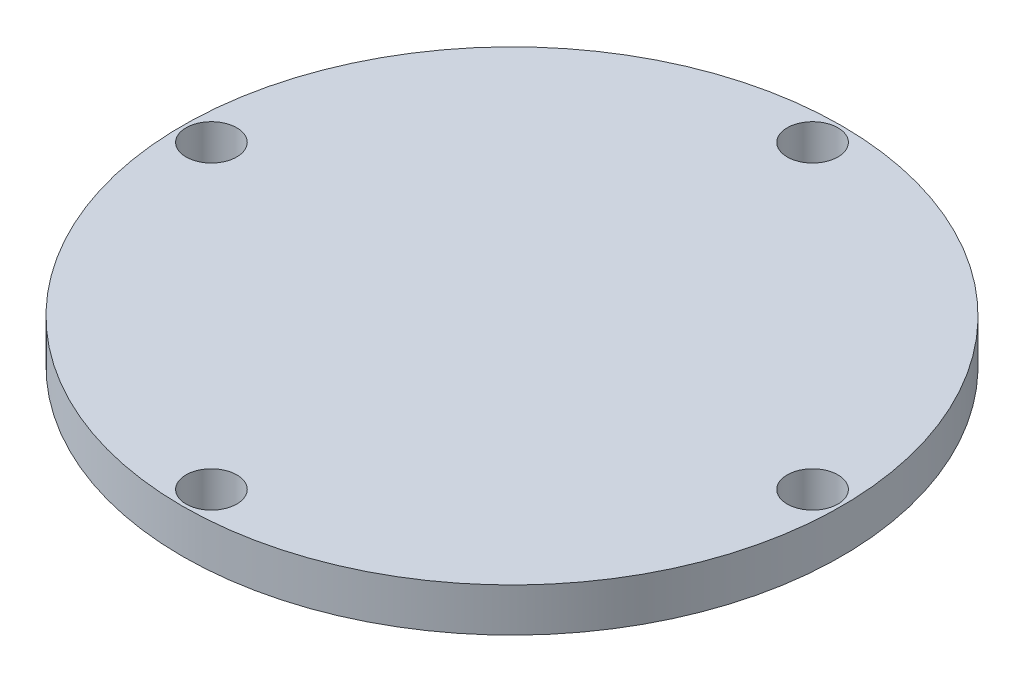
ISO-10303-21;
HEADER;
FILE_DESCRIPTION(('STEP AP214'),'2;1');
FILE_NAME('part.step','',(''),(''),'','','');
FILE_SCHEMA(('AUTOMOTIVE_DESIGN { 1 0 10303 214 1 1 1 1 }'));
ENDSEC;
DATA;
#1=APPLICATION_CONTEXT('core data for automotive mechanical design processes');
#2=APPLICATION_PROTOCOL_DEFINITION('international standard','automotive_design',2000,#1);
#3=PRODUCT_CONTEXT('',#1,'mechanical');
#4=PRODUCT('Part','Part','',(#3));
#5=PRODUCT_RELATED_PRODUCT_CATEGORY('part','',(#4));
#6=PRODUCT_DEFINITION_FORMATION('','',#4);
#7=PRODUCT_DEFINITION_CONTEXT('part definition',#1,'design');
#8=PRODUCT_DEFINITION('design','',#6,#7);
#9=PRODUCT_DEFINITION_SHAPE('','',#8);
#10=(LENGTH_UNIT() NAMED_UNIT(*) SI_UNIT(.MILLI.,.METRE.));
#11=(NAMED_UNIT(*) PLANE_ANGLE_UNIT() SI_UNIT($,.RADIAN.));
#12=(NAMED_UNIT(*) SI_UNIT($,.STERADIAN.) SOLID_ANGLE_UNIT());
#13=UNCERTAINTY_MEASURE_WITH_UNIT(LENGTH_MEASURE(1.E-05),#10,'distance_accuracy_value','');
#14=(GEOMETRIC_REPRESENTATION_CONTEXT(3) GLOBAL_UNCERTAINTY_ASSIGNED_CONTEXT((#13)) GLOBAL_UNIT_ASSIGNED_CONTEXT((#10,
#11,#12)) REPRESENTATION_CONTEXT('',''));
#15=CARTESIAN_POINT('',(0.,0.,0.));
#16=DIRECTION('',(0.,0.,1.));
#17=DIRECTION('',(1.,0.,0.));
#18=AXIS2_PLACEMENT_3D('',#15,#16,#17);
#19=CARTESIAN_POINT('',(0.,-1.524,0.));
#20=DIRECTION('',(0.,1.,0.));
#21=DIRECTION('',(0.,0.,1.));
#22=AXIS2_PLACEMENT_3D('',#19,#20,#21);
#23=CYLINDRICAL_SURFACE('',#22,11.557);
#24=CARTESIAN_POINT('',(0.,-1.524,0.));
#25=DIRECTION('',(0.,1.,0.));
#26=DIRECTION('',(0.,0.,1.));
#27=AXIS2_PLACEMENT_3D('',#24,#25,#26);
#28=CIRCLE('',#27,11.557);
#29=CARTESIAN_POINT('',(0.,-1.524,11.557));
#30=VERTEX_POINT('',#29);
#31=EDGE_CURVE('E10',#30,#30,#28,.T.);
#32=CARTESIAN_POINT('',(0.,0.,0.));
#33=DIRECTION('',(0.,1.,0.));
#34=DIRECTION('',(0.,0.,1.));
#35=AXIS2_PLACEMENT_3D('',#32,#33,#34);
#36=CIRCLE('',#35,11.557);
#37=CARTESIAN_POINT('',(0.,0.,11.557));
#38=VERTEX_POINT('',#37);
#39=EDGE_CURVE('E34',#38,#38,#36,.T.);
#40=CARTESIAN_POINT('',(0.,-1.524,11.557));
#41=CARTESIAN_POINT('',(0.,-1.508125,11.557));
#42=CARTESIAN_POINT('',(0.,-1.49225,11.557));
#43=CARTESIAN_POINT('',(0.,-1.4605,11.557));
#44=CARTESIAN_POINT('',(0.,-1.444625,11.557));
#45=CARTESIAN_POINT('',(0.,-1.412875,11.557));
#46=CARTESIAN_POINT('',(0.,-1.397,11.557));
#47=CARTESIAN_POINT('',(0.,-1.36525,11.557));
#48=CARTESIAN_POINT('',(0.,-1.349375,11.557));
#49=CARTESIAN_POINT('',(0.,-1.317625,11.557));
#50=CARTESIAN_POINT('',(0.,-1.30175,11.557));
#51=CARTESIAN_POINT('',(0.,-1.27,11.557));
#52=CARTESIAN_POINT('',(0.,-1.254125,11.557));
#53=CARTESIAN_POINT('',(0.,-1.222375,11.557));
#54=CARTESIAN_POINT('',(0.,-1.2065,11.557));
#55=CARTESIAN_POINT('',(0.,-1.17475,11.557));
#56=CARTESIAN_POINT('',(0.,-1.158875,11.557));
#57=CARTESIAN_POINT('',(0.,-1.127125,11.557));
#58=CARTESIAN_POINT('',(0.,-1.11125,11.557));
#59=CARTESIAN_POINT('',(0.,-1.0795,11.557));
#60=CARTESIAN_POINT('',(0.,-1.063625,11.557));
#61=CARTESIAN_POINT('',(0.,-1.031875,11.557));
#62=CARTESIAN_POINT('',(0.,-1.016,11.557));
#63=CARTESIAN_POINT('',(0.,-0.98425,11.557));
#64=CARTESIAN_POINT('',(0.,-0.968375,11.557));
#65=CARTESIAN_POINT('',(0.,-0.936625,11.557));
#66=CARTESIAN_POINT('',(0.,-0.92075,11.557));
#67=CARTESIAN_POINT('',(0.,-0.889,11.557));
#68=CARTESIAN_POINT('',(0.,-0.873125,11.557));
#69=CARTESIAN_POINT('',(0.,-0.841375,11.557));
#70=CARTESIAN_POINT('',(0.,-0.8255,11.557));
#71=CARTESIAN_POINT('',(0.,-0.79375,11.557));
#72=CARTESIAN_POINT('',(0.,-0.777875,11.557));
#73=CARTESIAN_POINT('',(0.,-0.746125,11.557));
#74=CARTESIAN_POINT('',(0.,-0.73025,11.557));
#75=CARTESIAN_POINT('',(0.,-0.6985,11.557));
#76=CARTESIAN_POINT('',(0.,-0.682625,11.557));
#77=CARTESIAN_POINT('',(0.,-0.650875,11.557));
#78=CARTESIAN_POINT('',(0.,-0.635,11.557));
#79=CARTESIAN_POINT('',(0.,-0.60325,11.557));
#80=CARTESIAN_POINT('',(0.,-0.587375,11.557));
#81=CARTESIAN_POINT('',(0.,-0.555625,11.557));
#82=CARTESIAN_POINT('',(0.,-0.53975,11.557));
#83=CARTESIAN_POINT('',(0.,-0.508,11.557));
#84=CARTESIAN_POINT('',(0.,-0.492125,11.557));
#85=CARTESIAN_POINT('',(0.,-0.460375,11.557));
#86=CARTESIAN_POINT('',(0.,-0.4445,11.557));
#87=CARTESIAN_POINT('',(0.,-0.41275,11.557));
#88=CARTESIAN_POINT('',(0.,-0.396875,11.557));
#89=CARTESIAN_POINT('',(0.,-0.365125,11.557));
#90=CARTESIAN_POINT('',(0.,-0.34925,11.557));
#91=CARTESIAN_POINT('',(0.,-0.3175,11.557));
#92=CARTESIAN_POINT('',(0.,-0.301625,11.557));
#93=CARTESIAN_POINT('',(0.,-0.269875,11.557));
#94=CARTESIAN_POINT('',(0.,-0.254,11.557));
#95=CARTESIAN_POINT('',(0.,-0.22225,11.557));
#96=CARTESIAN_POINT('',(0.,-0.206375,11.557));
#97=CARTESIAN_POINT('',(0.,-0.174625,11.557));
#98=CARTESIAN_POINT('',(0.,-0.15875,11.557));
#99=CARTESIAN_POINT('',(0.,-0.127,11.557));
#100=CARTESIAN_POINT('',(0.,-0.111125,11.557));
#101=CARTESIAN_POINT('',(0.,-0.079375,11.557));
#102=CARTESIAN_POINT('',(0.,-0.0635,11.557));
#103=CARTESIAN_POINT('',(0.,-0.0317499999999999,11.557));
#104=CARTESIAN_POINT('',(0.,-0.015875,11.557));
#105=CARTESIAN_POINT('',(0.,0.,11.557));
#106=B_SPLINE_CURVE_WITH_KNOTS('',3,(#40,#41,#42,#43,#44,#45,#46,#47,#48,#49,#50,#51,#52,#53,
#54,#55,#56,#57,#58,#59,#60,#61,#62,#63,#64,#65,#66,#67,#68,#69,#70,#71,#72,#73,#74,#75,#76,#77,
#78,#79,#80,#81,#82,#83,#84,#85,#86,#87,#88,#89,#90,#91,#92,#93,#94,#95,#96,#97,#98,#99,#100,
#101,#102,#103,#104,#105),.UNSPECIFIED.,.F.,.F.,(4,2,2,2,2,2,2,2,2,2,2,2,2,2,2,2,2,2,2,2,2,2,2,
2,2,2,2,2,2,2,2,2,4),(0.,0.0476249999999999,0.0952499999999998,0.142875,0.1905,0.238125,0.28575,
0.333375,0.381,0.428625,0.47625,0.523875,0.5715,0.619125,0.66675,0.714375,0.762,0.809625,
0.85725,0.904875,0.9525,1.000125,1.04775,1.095375,1.143,1.190625,1.23825,1.285875,1.3335,
1.381125,1.42875,1.476375,1.524),.UNSPECIFIED.);
#107=EDGE_CURVE('BSEAM31',#30,#38,#106,.T.);
#108=ORIENTED_EDGE('',*,*,#31,.T.);
#109=ORIENTED_EDGE('',*,*,#39,.F.);
#110=ORIENTED_EDGE('',*,*,#107,.T.);
#111=ORIENTED_EDGE('',*,*,#107,.F.);
#112=EDGE_LOOP('',(#108,#110,#109,#111));
#113=FACE_BOUND('',#112,.T.);
#114=ADVANCED_FACE('F31',(#113),#23,.T.);
#115=CARTESIAN_POINT('',(0.,-1.524,0.));
#116=DIRECTION('',(0.,1.,0.));
#117=DIRECTION('',(0.,0.,1.));
#118=AXIS2_PLACEMENT_3D('',#115,#116,#117);
#119=PLANE('',#118);
#120=CARTESIAN_POINT('',(-10.541,-1.524,-1.10411114378236E-13));
#121=DIRECTION('',(0.,1.,0.));
#122=DIRECTION('',(0.,0.,1.));
#123=AXIS2_PLACEMENT_3D('',#120,#121,#122);
#124=CIRCLE('',#123,0.888999999999989);
#125=CARTESIAN_POINT('',(-10.541,-1.524,0.888999999999878));
#126=VERTEX_POINT('',#125);
#127=EDGE_CURVE('E60',#126,#126,#124,.T.);
#128=ORIENTED_EDGE('',*,*,#127,.T.);
#129=EDGE_LOOP('',(#128));
#130=FACE_BOUND('',#129,.T.);
#131=CARTESIAN_POINT('',(0.,-1.524,10.541));
#132=DIRECTION('',(0.,1.,0.));
#133=DIRECTION('',(0.,0.,1.));
#134=AXIS2_PLACEMENT_3D('',#131,#132,#133);
#135=CIRCLE('',#134,0.888999999999988);
#136=CARTESIAN_POINT('',(0.,-1.524,11.43));
#137=VERTEX_POINT('',#136);
#138=EDGE_CURVE('E54',#137,#137,#135,.T.);
#139=ORIENTED_EDGE('',*,*,#138,.T.);
#140=EDGE_LOOP('',(#139));
#141=FACE_BOUND('',#140,.T.);
#142=CARTESIAN_POINT('',(10.541,-1.524,0.));
#143=DIRECTION('',(0.,1.,0.));
#144=DIRECTION('',(0.,0.,1.));
#145=AXIS2_PLACEMENT_3D('',#142,#143,#144);
#146=CIRCLE('',#145,0.888999999999989);
#147=CARTESIAN_POINT('',(10.541,-1.524,0.889000000000026));
#148=VERTEX_POINT('',#147);
#149=EDGE_CURVE('E48',#148,#148,#146,.T.);
#150=ORIENTED_EDGE('',*,*,#149,.T.);
#151=EDGE_LOOP('',(#150));
#152=FACE_BOUND('',#151,.T.);
#153=CARTESIAN_POINT('',(0.,-1.524,-10.541));
#154=DIRECTION('',(0.,1.,0.));
#155=DIRECTION('',(0.,0.,1.));
#156=AXIS2_PLACEMENT_3D('',#153,#154,#155);
#157=CIRCLE('',#156,0.888999999999988);
#158=CARTESIAN_POINT('',(0.,-1.524,-9.65200000000001));
#159=VERTEX_POINT('',#158);
#160=EDGE_CURVE('E41',#159,#159,#157,.T.);
#161=ORIENTED_EDGE('',*,*,#160,.T.);
#162=EDGE_LOOP('',(#161));
#163=FACE_BOUND('',#162,.T.);
#164=ORIENTED_EDGE('',*,*,#31,.F.);
#165=EDGE_LOOP('',(#164));
#166=FACE_BOUND('',#165,.T.);
#167=ADVANCED_FACE('F73',(#130,#141,#152,#163,#166),#119,.F.);
#168=CARTESIAN_POINT('',(0.,0.,0.));
#169=DIRECTION('',(0.,1.,0.));
#170=DIRECTION('',(0.,0.,1.));
#171=AXIS2_PLACEMENT_3D('',#168,#169,#170);
#172=PLANE('',#171);
#173=CARTESIAN_POINT('',(-10.541,0.,-1.10411114378236E-13));
#174=DIRECTION('',(0.,1.,0.));
#175=DIRECTION('',(0.,0.,1.));
#176=AXIS2_PLACEMENT_3D('',#173,#174,#175);
#177=CIRCLE('',#176,0.888999999999989);
#178=CARTESIAN_POINT('',(-10.541,0.,0.888999999999878));
#179=VERTEX_POINT('',#178);
#180=EDGE_CURVE('E63',#179,#179,#177,.T.);
#181=ORIENTED_EDGE('',*,*,#180,.F.);
#182=EDGE_LOOP('',(#181));
#183=FACE_BOUND('',#182,.T.);
#184=CARTESIAN_POINT('',(0.,0.,10.541));
#185=DIRECTION('',(0.,1.,0.));
#186=DIRECTION('',(0.,0.,1.));
#187=AXIS2_PLACEMENT_3D('',#184,#185,#186);
#188=CIRCLE('',#187,0.888999999999989);
#189=CARTESIAN_POINT('',(0.,0.,11.43));
#190=VERTEX_POINT('',#189);
#191=EDGE_CURVE('E57',#190,#190,#188,.T.);
#192=ORIENTED_EDGE('',*,*,#191,.F.);
#193=EDGE_LOOP('',(#192));
#194=FACE_BOUND('',#193,.T.);
#195=CARTESIAN_POINT('',(10.541,0.,0.));
#196=DIRECTION('',(0.,1.,0.));
#197=DIRECTION('',(0.,0.,1.));
#198=AXIS2_PLACEMENT_3D('',#195,#196,#197);
#199=CIRCLE('',#198,0.888999999999989);
#200=CARTESIAN_POINT('',(10.541,0.,0.889000000000026));
#201=VERTEX_POINT('',#200);
#202=EDGE_CURVE('E51',#201,#201,#199,.T.);
#203=ORIENTED_EDGE('',*,*,#202,.F.);
#204=EDGE_LOOP('',(#203));
#205=FACE_BOUND('',#204,.T.);
#206=CARTESIAN_POINT('',(0.,0.,-10.541));
#207=DIRECTION('',(0.,1.,0.));
#208=DIRECTION('',(0.,0.,1.));
#209=AXIS2_PLACEMENT_3D('',#206,#207,#208);
#210=CIRCLE('',#209,0.888999999999989);
#211=CARTESIAN_POINT('',(0.,0.,-9.65200000000001));
#212=VERTEX_POINT('',#211);
#213=EDGE_CURVE('E45',#212,#212,#210,.T.);
#214=ORIENTED_EDGE('',*,*,#213,.F.);
#215=EDGE_LOOP('',(#214));
#216=FACE_BOUND('',#215,.T.);
#217=ORIENTED_EDGE('',*,*,#39,.T.);
#218=EDGE_LOOP('',(#217));
#219=FACE_BOUND('',#218,.T.);
#220=ADVANCED_FACE('F69',(#183,#194,#205,#216,#219),#172,.T.);
#221=CARTESIAN_POINT('',(0.,0.,-10.541));
#222=DIRECTION('',(0.,1.,0.));
#223=DIRECTION('',(0.,0.,1.));
#224=AXIS2_PLACEMENT_3D('',#221,#222,#223);
#225=CYLINDRICAL_SURFACE('',#224,0.888999999999989);
#226=ORIENTED_EDGE('',*,*,#160,.F.);
#227=EDGE_LOOP('',(#226));
#228=FACE_BOUND('',#227,.T.);
#229=ORIENTED_EDGE('',*,*,#213,.T.);
#230=EDGE_LOOP('',(#229));
#231=FACE_BOUND('',#230,.T.);
#232=ADVANCED_FACE('F72',(#228,#231),#225,.F.);
#233=CARTESIAN_POINT('',(10.541,0.,0.));
#234=DIRECTION('',(0.,1.,0.));
#235=DIRECTION('',(0.,0.,1.));
#236=AXIS2_PLACEMENT_3D('',#233,#234,#235);
#237=CYLINDRICAL_SURFACE('',#236,0.888999999999989);
#238=ORIENTED_EDGE('',*,*,#149,.F.);
#239=EDGE_LOOP('',(#238));
#240=FACE_BOUND('',#239,.T.);
#241=ORIENTED_EDGE('',*,*,#202,.T.);
#242=EDGE_LOOP('',(#241));
#243=FACE_BOUND('',#242,.T.);
#244=ADVANCED_FACE('F94',(#240,#243),#237,.F.);
#245=CARTESIAN_POINT('',(0.,0.,10.541));
#246=DIRECTION('',(0.,1.,0.));
#247=DIRECTION('',(0.,0.,1.));
#248=AXIS2_PLACEMENT_3D('',#245,#246,#247);
#249=CYLINDRICAL_SURFACE('',#248,0.888999999999989);
#250=ORIENTED_EDGE('',*,*,#138,.F.);
#251=EDGE_LOOP('',(#250));
#252=FACE_BOUND('',#251,.T.);
#253=ORIENTED_EDGE('',*,*,#191,.T.);
#254=EDGE_LOOP('',(#253));
#255=FACE_BOUND('',#254,.T.);
#256=ADVANCED_FACE('F98',(#252,#255),#249,.F.);
#257=CARTESIAN_POINT('',(-10.541,0.,-1.10411114378236E-13));
#258=DIRECTION('',(0.,1.,0.));
#259=DIRECTION('',(0.,0.,1.));
#260=AXIS2_PLACEMENT_3D('',#257,#258,#259);
#261=CYLINDRICAL_SURFACE('',#260,0.888999999999989);
#262=ORIENTED_EDGE('',*,*,#127,.F.);
#263=EDGE_LOOP('',(#262));
#264=FACE_BOUND('',#263,.T.);
#265=ORIENTED_EDGE('',*,*,#180,.T.);
#266=EDGE_LOOP('',(#265));
#267=FACE_BOUND('',#266,.T.);
#268=ADVANCED_FACE('F67',(#264,#267),#261,.F.);
#269=CLOSED_SHELL('',(#114,#167,#220,#232,#244,#256,#268));
#270=MANIFOLD_SOLID_BREP('B2',#269);
#271=ADVANCED_BREP_SHAPE_REPRESENTATION('',(#18,#270),#14);
#272=SHAPE_DEFINITION_REPRESENTATION(#9,#271);
ENDSEC;
END-ISO-10303-21;
